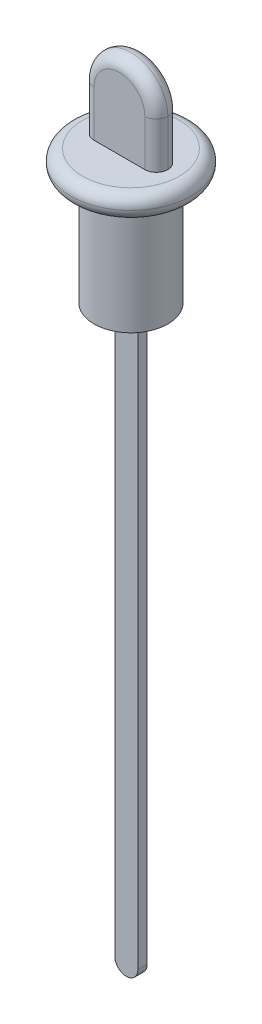
ISO-10303-21;
HEADER;
FILE_DESCRIPTION(('STEP AP214'),'2;1');
FILE_NAME('part.step','',(''),(''),'','','');
FILE_SCHEMA(('AUTOMOTIVE_DESIGN { 1 0 10303 214 1 1 1 1 }'));
ENDSEC;
DATA;
#1=APPLICATION_CONTEXT('core data for automotive mechanical design processes');
#2=APPLICATION_PROTOCOL_DEFINITION('international standard','automotive_design',2000,#1);
#3=PRODUCT_CONTEXT('',#1,'mechanical');
#4=PRODUCT('Part','Part','',(#3));
#5=PRODUCT_RELATED_PRODUCT_CATEGORY('part','',(#4));
#6=PRODUCT_DEFINITION_FORMATION('','',#4);
#7=PRODUCT_DEFINITION_CONTEXT('part definition',#1,'design');
#8=PRODUCT_DEFINITION('design','',#6,#7);
#9=PRODUCT_DEFINITION_SHAPE('','',#8);
#10=(LENGTH_UNIT() NAMED_UNIT(*) SI_UNIT(.MILLI.,.METRE.));
#11=(NAMED_UNIT(*) PLANE_ANGLE_UNIT() SI_UNIT($,.RADIAN.));
#12=(NAMED_UNIT(*) SI_UNIT($,.STERADIAN.) SOLID_ANGLE_UNIT());
#13=UNCERTAINTY_MEASURE_WITH_UNIT(LENGTH_MEASURE(1.E-05),#10,'distance_accuracy_value','');
#14=(GEOMETRIC_REPRESENTATION_CONTEXT(3) GLOBAL_UNCERTAINTY_ASSIGNED_CONTEXT((#13)) GLOBAL_UNIT_ASSIGNED_CONTEXT((#10,
#11,#12)) REPRESENTATION_CONTEXT('',''));
#15=CARTESIAN_POINT('',(0.,0.,0.));
#16=DIRECTION('',(0.,0.,1.));
#17=DIRECTION('',(1.,0.,0.));
#18=AXIS2_PLACEMENT_3D('',#15,#16,#17);
#19=CARTESIAN_POINT('',(0.,-15.24,0.));
#20=DIRECTION('',(0.,1.,0.));
#21=DIRECTION('',(0.,0.,1.));
#22=AXIS2_PLACEMENT_3D('',#19,#20,#21);
#23=PLANE('',#22);
#24=CARTESIAN_POINT('',(0.,-15.24,0.));
#25=DIRECTION('',(0.,1.,0.));
#26=DIRECTION('',(0.,0.,1.));
#27=AXIS2_PLACEMENT_3D('',#24,#25,#26);
#28=CIRCLE('',#27,5.08);
#29=CARTESIAN_POINT('',(0.,-15.24,5.08));
#30=VERTEX_POINT('',#29);
#31=EDGE_CURVE('E151',#30,#30,#28,.T.);
#32=ORIENTED_EDGE('',*,*,#31,.F.);
#33=EDGE_LOOP('',(#32));
#34=FACE_BOUND('',#33,.T.);
#35=DIRECTION('',(0.,0.,-1.));
#36=VECTOR('',#35,1.);
#37=CARTESIAN_POINT('',(-1.5875,-15.24,-0.635));
#38=LINE('',#37,#36);
#39=CARTESIAN_POINT('',(-1.5875,-15.24,0.635));
#40=VERTEX_POINT('',#39);
#41=CARTESIAN_POINT('',(-1.5875,-15.24,-0.635));
#42=VERTEX_POINT('',#41);
#43=EDGE_CURVE('E116',#40,#42,#38,.T.);
#44=ORIENTED_EDGE('',*,*,#43,.F.);
#45=DIRECTION('',(-1.,0.,0.));
#46=VECTOR('',#45,1.);
#47=CARTESIAN_POINT('',(1.5875,-15.24,0.635));
#48=LINE('',#47,#46);
#49=CARTESIAN_POINT('',(1.5875,-15.24,0.635));
#50=VERTEX_POINT('',#49);
#51=EDGE_CURVE('E121',#50,#40,#48,.T.);
#52=ORIENTED_EDGE('',*,*,#51,.F.);
#53=DIRECTION('',(0.,0.,1.));
#54=VECTOR('',#53,1.);
#55=CARTESIAN_POINT('',(1.5875,-15.24,-0.635));
#56=LINE('',#55,#54);
#57=CARTESIAN_POINT('',(1.5875,-15.24,-0.635));
#58=VERTEX_POINT('',#57);
#59=EDGE_CURVE('E132',#58,#50,#56,.T.);
#60=ORIENTED_EDGE('',*,*,#59,.F.);
#61=DIRECTION('',(1.,0.,0.));
#62=VECTOR('',#61,1.);
#63=CARTESIAN_POINT('',(1.5875,-15.24,-0.635));
#64=LINE('',#63,#62);
#65=EDGE_CURVE('E129',#42,#58,#64,.T.);
#66=ORIENTED_EDGE('',*,*,#65,.F.);
#67=EDGE_LOOP('',(#44,#52,#60,#66));
#68=FACE_BOUND('',#67,.T.);
#69=ADVANCED_FACE('F32',(#34,#68),#23,.F.);
#70=CARTESIAN_POINT('',(0.,3.175,0.));
#71=DIRECTION('',(0.,1.,0.));
#72=DIRECTION('',(0.,0.,1.));
#73=AXIS2_PLACEMENT_3D('',#70,#71,#72);
#74=PLANE('',#73);
#75=CARTESIAN_POINT('',(0.,3.175,0.));
#76=DIRECTION('',(0.,1.,0.));
#77=DIRECTION('',(0.,0.,1.));
#78=AXIS2_PLACEMENT_3D('',#75,#76,#77);
#79=CIRCLE('',#78,6.6675);
#80=CARTESIAN_POINT('',(0.,3.175,6.6675));
#81=VERTEX_POINT('',#80);
#82=EDGE_CURVE('E172',#81,#81,#79,.T.);
#83=ORIENTED_EDGE('',*,*,#82,.T.);
#84=EDGE_LOOP('',(#83));
#85=FACE_BOUND('',#84,.T.);
#86=DIRECTION('',(1.,0.,0.));
#87=VECTOR('',#86,1.);
#88=CARTESIAN_POINT('',(5.08,3.175,1.5875));
#89=LINE('',#88,#87);
#90=CARTESIAN_POINT('',(-3.4925,3.175,1.5875));
#91=VERTEX_POINT('',#90);
#92=CARTESIAN_POINT('',(3.4925,3.175,1.5875));
#93=VERTEX_POINT('',#92);
#94=EDGE_CURVE('E143',#91,#93,#89,.T.);
#95=ORIENTED_EDGE('',*,*,#94,.F.);
#96=CARTESIAN_POINT('',(-3.4925,3.175,0.));
#97=DIRECTION('',(0.,1.,0.));
#98=DIRECTION('',(0.,0.,1.));
#99=AXIS2_PLACEMENT_3D('',#96,#97,#98);
#100=CIRCLE('',#99,1.5875);
#101=CARTESIAN_POINT('',(-5.08,3.175,0.));
#102=VERTEX_POINT('',#101);
#103=EDGE_CURVE('E179',#91,#102,#100,.F.);
#104=ORIENTED_EDGE('',*,*,#103,.T.);
#105=CARTESIAN_POINT('',(-3.4925,3.175,0.));
#106=DIRECTION('',(0.,1.,0.));
#107=DIRECTION('',(0.,0.,1.));
#108=AXIS2_PLACEMENT_3D('',#105,#106,#107);
#109=CIRCLE('',#108,1.5875);
#110=CARTESIAN_POINT('',(-3.4925,3.175,-1.5875));
#111=VERTEX_POINT('',#110);
#112=EDGE_CURVE('E177',#102,#111,#109,.F.);
#113=ORIENTED_EDGE('',*,*,#112,.T.);
#114=DIRECTION('',(1.,0.,0.));
#115=VECTOR('',#114,1.);
#116=CARTESIAN_POINT('',(5.08,3.175,-1.5875));
#117=LINE('',#116,#115);
#118=CARTESIAN_POINT('',(3.4925,3.175,-1.5875));
#119=VERTEX_POINT('',#118);
#120=EDGE_CURVE('E147',#111,#119,#117,.T.);
#121=ORIENTED_EDGE('',*,*,#120,.T.);
#122=CARTESIAN_POINT('',(3.4925,3.175,0.));
#123=DIRECTION('',(0.,1.,0.));
#124=DIRECTION('',(0.,0.,1.));
#125=AXIS2_PLACEMENT_3D('',#122,#123,#124);
#126=CIRCLE('',#125,1.5875);
#127=CARTESIAN_POINT('',(5.08,3.175,0.));
#128=VERTEX_POINT('',#127);
#129=EDGE_CURVE('E175',#119,#128,#126,.F.);
#130=ORIENTED_EDGE('',*,*,#129,.T.);
#131=CARTESIAN_POINT('',(3.4925,3.175,0.));
#132=DIRECTION('',(0.,1.,0.));
#133=DIRECTION('',(0.,0.,1.));
#134=AXIS2_PLACEMENT_3D('',#131,#132,#133);
#135=CIRCLE('',#134,1.5875);
#136=EDGE_CURVE('E181',#128,#93,#135,.F.);
#137=ORIENTED_EDGE('',*,*,#136,.T.);
#138=EDGE_LOOP('',(#95,#104,#113,#121,#130,#137));
#139=FACE_BOUND('',#138,.T.);
#140=ADVANCED_FACE('F233',(#85,#139),#74,.T.);
#141=CARTESIAN_POINT('',(0.,-15.24,0.));
#142=DIRECTION('',(0.,1.,0.));
#143=DIRECTION('',(0.,0.,1.));
#144=AXIS2_PLACEMENT_3D('',#141,#142,#143);
#145=CYLINDRICAL_SURFACE('',#144,5.08);
#146=CARTESIAN_POINT('',(0.,0.,0.));
#147=DIRECTION('',(0.,1.,0.));
#148=DIRECTION('',(0.,0.,1.));
#149=AXIS2_PLACEMENT_3D('',#146,#147,#148);
#150=CIRCLE('',#149,5.08);
#151=CARTESIAN_POINT('',(0.,0.,5.08));
#152=VERTEX_POINT('',#151);
#153=EDGE_CURVE('E146',#152,#152,#150,.T.);
#154=CARTESIAN_POINT('',(0.,-15.24,5.08));
#155=CARTESIAN_POINT('',(0.,-15.08125,5.08));
#156=CARTESIAN_POINT('',(0.,-14.9225,5.08));
#157=CARTESIAN_POINT('',(0.,-14.605,5.08));
#158=CARTESIAN_POINT('',(0.,-14.44625,5.08));
#159=CARTESIAN_POINT('',(0.,-14.12875,5.08));
#160=CARTESIAN_POINT('',(0.,-13.97,5.08));
#161=CARTESIAN_POINT('',(0.,-13.6525,5.08));
#162=CARTESIAN_POINT('',(0.,-13.49375,5.08));
#163=CARTESIAN_POINT('',(0.,-13.17625,5.08));
#164=CARTESIAN_POINT('',(0.,-13.0175,5.08));
#165=CARTESIAN_POINT('',(0.,-12.7,5.08));
#166=CARTESIAN_POINT('',(0.,-12.54125,5.08));
#167=CARTESIAN_POINT('',(0.,-12.22375,5.08));
#168=CARTESIAN_POINT('',(0.,-12.065,5.08));
#169=CARTESIAN_POINT('',(0.,-11.7475,5.08));
#170=CARTESIAN_POINT('',(0.,-11.58875,5.08));
#171=CARTESIAN_POINT('',(0.,-11.27125,5.08));
#172=CARTESIAN_POINT('',(0.,-11.1125,5.08));
#173=CARTESIAN_POINT('',(0.,-10.795,5.08));
#174=CARTESIAN_POINT('',(0.,-10.63625,5.08));
#175=CARTESIAN_POINT('',(0.,-10.31875,5.08));
#176=CARTESIAN_POINT('',(0.,-10.16,5.08));
#177=CARTESIAN_POINT('',(0.,-9.8425,5.08));
#178=CARTESIAN_POINT('',(0.,-9.68375,5.08));
#179=CARTESIAN_POINT('',(0.,-9.36625,5.08));
#180=CARTESIAN_POINT('',(0.,-9.2075,5.08));
#181=CARTESIAN_POINT('',(0.,-8.89,5.08));
#182=CARTESIAN_POINT('',(0.,-8.73125,5.08));
#183=CARTESIAN_POINT('',(0.,-8.41375,5.08));
#184=CARTESIAN_POINT('',(0.,-8.255,5.08));
#185=CARTESIAN_POINT('',(0.,-7.9375,5.08));
#186=CARTESIAN_POINT('',(0.,-7.77875,5.08));
#187=CARTESIAN_POINT('',(0.,-7.46125,5.08));
#188=CARTESIAN_POINT('',(0.,-7.3025,5.08));
#189=CARTESIAN_POINT('',(0.,-6.985,5.08));
#190=CARTESIAN_POINT('',(0.,-6.82625,5.08));
#191=CARTESIAN_POINT('',(0.,-6.50875,5.08));
#192=CARTESIAN_POINT('',(0.,-6.35,5.08));
#193=CARTESIAN_POINT('',(0.,-6.0325,5.08));
#194=CARTESIAN_POINT('',(0.,-5.87375,5.08));
#195=CARTESIAN_POINT('',(0.,-5.55625,5.08));
#196=CARTESIAN_POINT('',(0.,-5.3975,5.08));
#197=CARTESIAN_POINT('',(0.,-5.08,5.08));
#198=CARTESIAN_POINT('',(0.,-4.92125,5.08));
#199=CARTESIAN_POINT('',(0.,-4.60375,5.08));
#200=CARTESIAN_POINT('',(0.,-4.445,5.08));
#201=CARTESIAN_POINT('',(0.,-4.1275,5.08));
#202=CARTESIAN_POINT('',(0.,-3.96875,5.08));
#203=CARTESIAN_POINT('',(0.,-3.65125,5.08));
#204=CARTESIAN_POINT('',(0.,-3.4925,5.08));
#205=CARTESIAN_POINT('',(0.,-3.175,5.08));
#206=CARTESIAN_POINT('',(0.,-3.01625,5.08));
#207=CARTESIAN_POINT('',(0.,-2.69875,5.08));
#208=CARTESIAN_POINT('',(0.,-2.54,5.08));
#209=CARTESIAN_POINT('',(0.,-2.2225,5.08));
#210=CARTESIAN_POINT('',(0.,-2.06375,5.08));
#211=CARTESIAN_POINT('',(0.,-1.74625,5.08));
#212=CARTESIAN_POINT('',(0.,-1.5875,5.08));
#213=CARTESIAN_POINT('',(0.,-1.27,5.08));
#214=CARTESIAN_POINT('',(0.,-1.11125,5.08));
#215=CARTESIAN_POINT('',(0.,-0.79375,5.08));
#216=CARTESIAN_POINT('',(0.,-0.634999999999999,5.08));
#217=CARTESIAN_POINT('',(0.,-0.3175,5.08));
#218=CARTESIAN_POINT('',(0.,-0.15875,5.08));
#219=CARTESIAN_POINT('',(0.,0.,5.08));
#220=B_SPLINE_CURVE_WITH_KNOTS('',3,(#154,#155,#156,#157,#158,#159,#160,#161,#162,#163,#164,
#165,#166,#167,#168,#169,#170,#171,#172,#173,#174,#175,#176,#177,#178,#179,#180,#181,#182,#183,
#184,#185,#186,#187,#188,#189,#190,#191,#192,#193,#194,#195,#196,#197,#198,#199,#200,#201,#202,
#203,#204,#205,#206,#207,#208,#209,#210,#211,#212,#213,#214,#215,#216,#217,#218,#219),
.UNSPECIFIED.,.F.,.F.,(4,2,2,2,2,2,2,2,2,2,2,2,2,2,2,2,2,2,2,2,2,2,2,2,2,2,2,2,2,2,2,2,4),(0.,
0.476250000000001,0.9525,1.42875,1.905,2.38125,2.8575,3.33375,3.81,4.28625,4.7625,5.23875,5.715,
6.19125,6.6675,7.14375,7.62,8.09625,8.5725,9.04875,9.525,10.00125,10.4775,10.95375,11.43,
11.90625,12.3825,12.85875,13.335,13.81125,14.2875,14.76375,15.24),.UNSPECIFIED.);
#221=EDGE_CURVE('BSEAM239',#30,#152,#220,.T.);
#222=ORIENTED_EDGE('',*,*,#31,.T.);
#223=ORIENTED_EDGE('',*,*,#153,.F.);
#224=ORIENTED_EDGE('',*,*,#221,.T.);
#225=ORIENTED_EDGE('',*,*,#221,.F.);
#226=EDGE_LOOP('',(#222,#224,#223,#225));
#227=FACE_BOUND('',#226,.T.);
#228=ADVANCED_FACE('F239',(#227),#145,.T.);
#229=CARTESIAN_POINT('',(0.,0.,0.));
#230=DIRECTION('',(0.,1.,0.));
#231=DIRECTION('',(0.,0.,1.));
#232=AXIS2_PLACEMENT_3D('',#229,#230,#231);
#233=PLANE('',#232);
#234=CARTESIAN_POINT('',(0.,0.,0.));
#235=DIRECTION('',(0.,1.,0.));
#236=DIRECTION('',(0.,0.,1.));
#237=AXIS2_PLACEMENT_3D('',#234,#235,#236);
#238=CIRCLE('',#237,6.6675);
#239=CARTESIAN_POINT('',(0.,0.,6.6675));
#240=VERTEX_POINT('',#239);
#241=EDGE_CURVE('E169',#240,#240,#238,.F.);
#242=ORIENTED_EDGE('',*,*,#241,.T.);
#243=EDGE_LOOP('',(#242));
#244=FACE_BOUND('',#243,.T.);
#245=ORIENTED_EDGE('',*,*,#153,.T.);
#246=EDGE_LOOP('',(#245));
#247=FACE_BOUND('',#246,.T.);
#248=ADVANCED_FACE('F245',(#244,#247),#233,.F.);
#249=CARTESIAN_POINT('',(0.,9.525,1.5875));
#250=DIRECTION('',(0.,0.,-1.));
#251=DIRECTION('',(-1.,0.,0.));
#252=AXIS2_PLACEMENT_3D('',#249,#250,#251);
#253=PLANE('',#252);
#254=CARTESIAN_POINT('',(0.,9.525,1.5875));
#255=DIRECTION('',(0.,0.,-1.));
#256=DIRECTION('',(-1.,0.,0.));
#257=AXIS2_PLACEMENT_3D('',#254,#255,#256);
#258=CIRCLE('',#257,3.4925);
#259=CARTESIAN_POINT('',(3.4925,9.525,1.5875));
#260=VERTEX_POINT('',#259);
#261=CARTESIAN_POINT('',(-3.4925,9.525,1.5875));
#262=VERTEX_POINT('',#261);
#263=EDGE_CURVE('E165',#260,#262,#258,.F.);
#264=ORIENTED_EDGE('',*,*,#263,.T.);
#265=DIRECTION('',(0.,-1.,0.));
#266=VECTOR('',#265,1.);
#267=CARTESIAN_POINT('',(-3.4925,9.525,1.5875));
#268=LINE('',#267,#266);
#269=EDGE_CURVE('E167',#262,#91,#268,.T.);
#270=ORIENTED_EDGE('',*,*,#269,.T.);
#271=ORIENTED_EDGE('',*,*,#94,.T.);
#272=DIRECTION('',(0.,1.,0.));
#273=VECTOR('',#272,1.);
#274=CARTESIAN_POINT('',(3.4925,9.525,1.5875));
#275=LINE('',#274,#273);
#276=EDGE_CURVE('E163',#93,#260,#275,.T.);
#277=ORIENTED_EDGE('',*,*,#276,.T.);
#278=EDGE_LOOP('',(#264,#270,#271,#277));
#279=FACE_BOUND('',#278,.T.);
#280=ADVANCED_FACE('F370',(#279),#253,.F.);
#281=CARTESIAN_POINT('',(0.,9.525,-1.5875));
#282=DIRECTION('',(0.,0.,-1.));
#283=DIRECTION('',(-1.,0.,0.));
#284=AXIS2_PLACEMENT_3D('',#281,#282,#283);
#285=PLANE('',#284);
#286=CARTESIAN_POINT('',(0.,9.525,-1.5875));
#287=DIRECTION('',(0.,0.,-1.));
#288=DIRECTION('',(-1.,0.,0.));
#289=AXIS2_PLACEMENT_3D('',#286,#287,#288);
#290=CIRCLE('',#289,3.4925);
#291=CARTESIAN_POINT('',(-3.4925,9.525,-1.5875));
#292=VERTEX_POINT('',#291);
#293=CARTESIAN_POINT('',(3.4925,9.525,-1.5875));
#294=VERTEX_POINT('',#293);
#295=EDGE_CURVE('E154',#292,#294,#290,.T.);
#296=ORIENTED_EDGE('',*,*,#295,.T.);
#297=DIRECTION('',(0.,1.,0.));
#298=VECTOR('',#297,1.);
#299=CARTESIAN_POINT('',(3.4925,3.175,-1.5875));
#300=LINE('',#299,#298);
#301=EDGE_CURVE('E160',#294,#119,#300,.F.);
#302=ORIENTED_EDGE('',*,*,#301,.T.);
#303=ORIENTED_EDGE('',*,*,#120,.F.);
#304=DIRECTION('',(0.,-1.,0.));
#305=VECTOR('',#304,1.);
#306=CARTESIAN_POINT('',(-3.4925,9.525,-1.5875));
#307=LINE('',#306,#305);
#308=EDGE_CURVE('E158',#111,#292,#307,.F.);
#309=ORIENTED_EDGE('',*,*,#308,.T.);
#310=EDGE_LOOP('',(#296,#302,#303,#309));
#311=FACE_BOUND('',#310,.T.);
#312=ADVANCED_FACE('F273',(#311),#285,.T.);
#313=CARTESIAN_POINT('',(-3.4925,9.525,0.));
#314=DIRECTION('',(0.,-1.,0.));
#315=DIRECTION('',(1.,0.,0.));
#316=AXIS2_PLACEMENT_3D('',#313,#314,#315);
#317=CYLINDRICAL_SURFACE('',#316,1.5875);
#318=ORIENTED_EDGE('',*,*,#103,.F.);
#319=ORIENTED_EDGE('',*,*,#269,.F.);
#320=CARTESIAN_POINT('',(-3.4925,9.525,0.));
#321=DIRECTION('',(0.,1.,0.));
#322=DIRECTION('',(0.,0.,1.));
#323=AXIS2_PLACEMENT_3D('',#320,#321,#322);
#324=CIRCLE('',#323,1.5875);
#325=CARTESIAN_POINT('',(-5.08,9.525,0.));
#326=VERTEX_POINT('',#325);
#327=EDGE_CURVE('E150',#326,#262,#324,.T.);
#328=ORIENTED_EDGE('',*,*,#327,.F.);
#329=DIRECTION('',(0.,-1.,0.));
#330=VECTOR('',#329,1.);
#331=CARTESIAN_POINT('',(-5.08,3.175,0.));
#332=LINE('',#331,#330);
#333=EDGE_CURVE('E199',#102,#326,#332,.F.);
#334=ORIENTED_EDGE('',*,*,#333,.F.);
#335=EDGE_LOOP('',(#318,#319,#328,#334));
#336=FACE_BOUND('',#335,.T.);
#337=ADVANCED_FACE('F269',(#336),#317,.T.);
#338=CARTESIAN_POINT('',(0.,9.525,0.));
#339=DIRECTION('',(0.,0.,-1.));
#340=DIRECTION('',(-1.,0.,0.));
#341=AXIS2_PLACEMENT_3D('',#338,#339,#340);
#342=TOROIDAL_SURFACE('',#341,3.4925,1.5875);
#343=ORIENTED_EDGE('',*,*,#327,.T.);
#344=ORIENTED_EDGE('',*,*,#263,.F.);
#345=CARTESIAN_POINT('',(3.4925,9.525,0.));
#346=DIRECTION('',(0.,-1.,0.));
#347=DIRECTION('',(0.,0.,-1.));
#348=AXIS2_PLACEMENT_3D('',#345,#346,#347);
#349=CIRCLE('',#348,1.5875);
#350=CARTESIAN_POINT('',(5.08,9.525,0.));
#351=VERTEX_POINT('',#350);
#352=EDGE_CURVE('E196',#351,#260,#349,.T.);
#353=ORIENTED_EDGE('',*,*,#352,.F.);
#354=CARTESIAN_POINT('',(0.,9.525,0.));
#355=DIRECTION('',(0.,0.,-1.));
#356=DIRECTION('',(-1.,0.,0.));
#357=AXIS2_PLACEMENT_3D('',#354,#355,#356);
#358=CIRCLE('',#357,5.08);
#359=EDGE_CURVE('E193',#326,#351,#358,.T.);
#360=ORIENTED_EDGE('',*,*,#359,.F.);
#361=EDGE_LOOP('',(#343,#344,#353,#360));
#362=FACE_BOUND('',#361,.T.);
#363=ADVANCED_FACE('F265',(#362),#342,.T.);
#364=CARTESIAN_POINT('',(-3.4925,3.175,0.));
#365=DIRECTION('',(0.,1.,0.));
#366=DIRECTION('',(-1.,0.,0.));
#367=AXIS2_PLACEMENT_3D('',#364,#365,#366);
#368=CYLINDRICAL_SURFACE('',#367,1.5875);
#369=ORIENTED_EDGE('',*,*,#112,.F.);
#370=ORIENTED_EDGE('',*,*,#333,.T.);
#371=CARTESIAN_POINT('',(-3.4925,9.525,0.));
#372=DIRECTION('',(0.,1.,0.));
#373=DIRECTION('',(0.,0.,1.));
#374=AXIS2_PLACEMENT_3D('',#371,#372,#373);
#375=CIRCLE('',#374,1.5875);
#376=EDGE_CURVE('E190',#292,#326,#375,.T.);
#377=ORIENTED_EDGE('',*,*,#376,.F.);
#378=ORIENTED_EDGE('',*,*,#308,.F.);
#379=EDGE_LOOP('',(#369,#370,#377,#378));
#380=FACE_BOUND('',#379,.T.);
#381=ADVANCED_FACE('F261',(#380),#368,.T.);
#382=CARTESIAN_POINT('',(3.4925,9.525,0.));
#383=DIRECTION('',(0.,1.,0.));
#384=DIRECTION('',(0.,0.,1.));
#385=AXIS2_PLACEMENT_3D('',#382,#383,#384);
#386=CYLINDRICAL_SURFACE('',#385,1.5875);
#387=ORIENTED_EDGE('',*,*,#276,.F.);
#388=ORIENTED_EDGE('',*,*,#136,.F.);
#389=DIRECTION('',(0.,1.,0.));
#390=VECTOR('',#389,1.);
#391=CARTESIAN_POINT('',(5.08,3.175,0.));
#392=LINE('',#391,#390);
#393=EDGE_CURVE('E187',#351,#128,#392,.F.);
#394=ORIENTED_EDGE('',*,*,#393,.F.);
#395=ORIENTED_EDGE('',*,*,#352,.T.);
#396=EDGE_LOOP('',(#387,#388,#394,#395));
#397=FACE_BOUND('',#396,.T.);
#398=ADVANCED_FACE('F257',(#397),#386,.T.);
#399=CARTESIAN_POINT('',(0.,9.525,0.));
#400=DIRECTION('',(0.,0.,-1.));
#401=DIRECTION('',(-1.,0.,0.));
#402=AXIS2_PLACEMENT_3D('',#399,#400,#401);
#403=TOROIDAL_SURFACE('',#402,3.4925,1.5875);
#404=ORIENTED_EDGE('',*,*,#376,.T.);
#405=ORIENTED_EDGE('',*,*,#359,.T.);
#406=CARTESIAN_POINT('',(3.4925,9.525,0.));
#407=DIRECTION('',(0.,-1.,0.));
#408=DIRECTION('',(0.,0.,-1.));
#409=AXIS2_PLACEMENT_3D('',#406,#407,#408);
#410=CIRCLE('',#409,1.5875);
#411=EDGE_CURVE('E184',#294,#351,#410,.T.);
#412=ORIENTED_EDGE('',*,*,#411,.F.);
#413=ORIENTED_EDGE('',*,*,#295,.F.);
#414=EDGE_LOOP('',(#404,#405,#412,#413));
#415=FACE_BOUND('',#414,.T.);
#416=ADVANCED_FACE('F253',(#415),#403,.T.);
#417=CARTESIAN_POINT('',(3.4925,3.175,0.));
#418=DIRECTION('',(0.,-1.,0.));
#419=DIRECTION('',(0.,0.,-1.));
#420=AXIS2_PLACEMENT_3D('',#417,#418,#419);
#421=CYLINDRICAL_SURFACE('',#420,1.5875);
#422=ORIENTED_EDGE('',*,*,#129,.F.);
#423=ORIENTED_EDGE('',*,*,#301,.F.);
#424=ORIENTED_EDGE('',*,*,#411,.T.);
#425=ORIENTED_EDGE('',*,*,#393,.T.);
#426=EDGE_LOOP('',(#422,#423,#424,#425));
#427=FACE_BOUND('',#426,.T.);
#428=ADVANCED_FACE('F249',(#427),#421,.T.);
#429=CARTESIAN_POINT('',(0.,1.5875,0.));
#430=DIRECTION('',(0.,1.,0.));
#431=DIRECTION('',(0.,0.,1.));
#432=AXIS2_PLACEMENT_3D('',#429,#430,#431);
#433=TOROIDAL_SURFACE('',#432,6.6675,1.5875);
#434=ORIENTED_EDGE('',*,*,#82,.F.);
#435=EDGE_LOOP('',(#434));
#436=FACE_BOUND('',#435,.T.);
#437=CARTESIAN_POINT('',(0.,1.5875,0.));
#438=DIRECTION('',(0.,1.,0.));
#439=DIRECTION('',(0.,0.,1.));
#440=AXIS2_PLACEMENT_3D('',#437,#438,#439);
#441=CIRCLE('',#440,8.255);
#442=CARTESIAN_POINT('',(0.,1.5875,8.255));
#443=VERTEX_POINT('',#442);
#444=EDGE_CURVE('E142',#443,#443,#441,.F.);
#445=ORIENTED_EDGE('',*,*,#444,.F.);
#446=EDGE_LOOP('',(#445));
#447=FACE_BOUND('',#446,.T.);
#448=ADVANCED_FACE('F252',(#436,#447),#433,.T.);
#449=CARTESIAN_POINT('',(0.,1.5875,0.));
#450=DIRECTION('',(0.,1.,0.));
#451=DIRECTION('',(0.,0.,1.));
#452=AXIS2_PLACEMENT_3D('',#449,#450,#451);
#453=TOROIDAL_SURFACE('',#452,6.6675,1.5875);
#454=ORIENTED_EDGE('',*,*,#241,.F.);
#455=EDGE_LOOP('',(#454));
#456=FACE_BOUND('',#455,.T.);
#457=ORIENTED_EDGE('',*,*,#444,.T.);
#458=EDGE_LOOP('',(#457));
#459=FACE_BOUND('',#458,.T.);
#460=ADVANCED_FACE('F275',(#456,#459),#453,.T.);
#461=CARTESIAN_POINT('',(-1.5875,-95.25,-0.635));
#462=DIRECTION('',(1.,0.,0.));
#463=DIRECTION('',(0.,0.,-1.));
#464=AXIS2_PLACEMENT_3D('',#461,#462,#463);
#465=PLANE('',#464);
#466=DIRECTION('',(0.,1.,0.));
#467=VECTOR('',#466,1.);
#468=CARTESIAN_POINT('',(-1.5875,-95.25,-0.635));
#469=LINE('',#468,#467);
#470=CARTESIAN_POINT('',(-1.5875,-93.6625,-0.635));
#471=VERTEX_POINT('',#470);
#472=EDGE_CURVE('E140',#471,#42,#469,.T.);
#473=ORIENTED_EDGE('',*,*,#472,.F.);
#474=DIRECTION('',(0.,0.,-1.));
#475=VECTOR('',#474,1.);
#476=CARTESIAN_POINT('',(-1.5875,-93.6625,0.635));
#477=LINE('',#476,#475);
#478=CARTESIAN_POINT('',(-1.5875,-93.6625,0.635));
#479=VERTEX_POINT('',#478);
#480=EDGE_CURVE('E118',#471,#479,#477,.F.);
#481=ORIENTED_EDGE('',*,*,#480,.T.);
#482=DIRECTION('',(0.,1.,0.));
#483=VECTOR('',#482,1.);
#484=CARTESIAN_POINT('',(-1.5875,-95.25,0.635));
#485=LINE('',#484,#483);
#486=EDGE_CURVE('E112',#479,#40,#485,.T.);
#487=ORIENTED_EDGE('',*,*,#486,.T.);
#488=ORIENTED_EDGE('',*,*,#43,.T.);
#489=EDGE_LOOP('',(#473,#481,#487,#488));
#490=FACE_BOUND('',#489,.T.);
#491=ADVANCED_FACE('F115',(#490),#465,.F.);
#492=CARTESIAN_POINT('',(1.5875,-95.25,-0.635));
#493=DIRECTION('',(0.,0.,1.));
#494=DIRECTION('',(1.,0.,0.));
#495=AXIS2_PLACEMENT_3D('',#492,#493,#494);
#496=PLANE('',#495);
#497=CARTESIAN_POINT('',(0.,-93.6625,-0.635));
#498=DIRECTION('',(0.,0.,1.));
#499=DIRECTION('',(1.,0.,0.));
#500=AXIS2_PLACEMENT_3D('',#497,#498,#499);
#501=CIRCLE('',#500,1.5875);
#502=CARTESIAN_POINT('',(1.5875,-93.6625,-0.635));
#503=VERTEX_POINT('',#502);
#504=CARTESIAN_POINT('',(0.,-95.25,-0.635));
#505=VERTEX_POINT('',#504);
#506=EDGE_CURVE('E183',#503,#505,#501,.F.);
#507=ORIENTED_EDGE('',*,*,#506,.T.);
#508=CARTESIAN_POINT('',(0.,-93.6625,-0.635));
#509=DIRECTION('',(0.,0.,1.));
#510=DIRECTION('',(1.,0.,0.));
#511=AXIS2_PLACEMENT_3D('',#508,#509,#510);
#512=CIRCLE('',#511,1.5875);
#513=EDGE_CURVE('E207',#505,#471,#512,.F.);
#514=ORIENTED_EDGE('',*,*,#513,.T.);
#515=ORIENTED_EDGE('',*,*,#472,.T.);
#516=ORIENTED_EDGE('',*,*,#65,.T.);
#517=DIRECTION('',(0.,1.,0.));
#518=VECTOR('',#517,1.);
#519=CARTESIAN_POINT('',(1.5875,-95.25,-0.635));
#520=LINE('',#519,#518);
#521=EDGE_CURVE('E138',#503,#58,#520,.T.);
#522=ORIENTED_EDGE('',*,*,#521,.F.);
#523=EDGE_LOOP('',(#507,#514,#515,#516,#522));
#524=FACE_BOUND('',#523,.T.);
#525=ADVANCED_FACE('F213',(#524),#496,.F.);
#526=CARTESIAN_POINT('',(1.5875,-95.25,-0.635));
#527=DIRECTION('',(-1.,0.,0.));
#528=DIRECTION('',(0.,0.,1.));
#529=AXIS2_PLACEMENT_3D('',#526,#527,#528);
#530=PLANE('',#529);
#531=DIRECTION('',(0.,1.,0.));
#532=VECTOR('',#531,1.);
#533=CARTESIAN_POINT('',(1.5875,-95.25,0.635));
#534=LINE('',#533,#532);
#535=CARTESIAN_POINT('',(1.5875,-93.6625,0.635));
#536=VERTEX_POINT('',#535);
#537=EDGE_CURVE('E120',#536,#50,#534,.T.);
#538=ORIENTED_EDGE('',*,*,#537,.F.);
#539=DIRECTION('',(0.,0.,1.));
#540=VECTOR('',#539,1.);
#541=CARTESIAN_POINT('',(1.5875,-93.6625,-0.635));
#542=LINE('',#541,#540);
#543=EDGE_CURVE('E11',#536,#503,#542,.F.);
#544=ORIENTED_EDGE('',*,*,#543,.T.);
#545=ORIENTED_EDGE('',*,*,#521,.T.);
#546=ORIENTED_EDGE('',*,*,#59,.T.);
#547=EDGE_LOOP('',(#538,#544,#545,#546));
#548=FACE_BOUND('',#547,.T.);
#549=ADVANCED_FACE('F223',(#548),#530,.F.);
#550=CARTESIAN_POINT('',(1.5875,-95.25,0.635));
#551=DIRECTION('',(0.,0.,-1.));
#552=DIRECTION('',(-1.,0.,0.));
#553=AXIS2_PLACEMENT_3D('',#550,#551,#552);
#554=PLANE('',#553);
#555=ORIENTED_EDGE('',*,*,#486,.F.);
#556=CARTESIAN_POINT('',(0.,-93.6625,0.635));
#557=DIRECTION('',(0.,0.,-1.));
#558=DIRECTION('',(-1.,0.,0.));
#559=AXIS2_PLACEMENT_3D('',#556,#557,#558);
#560=CIRCLE('',#559,1.5875);
#561=CARTESIAN_POINT('',(0.,-95.25,0.635));
#562=VERTEX_POINT('',#561);
#563=EDGE_CURVE('E41',#479,#562,#560,.F.);
#564=ORIENTED_EDGE('',*,*,#563,.T.);
#565=CARTESIAN_POINT('',(0.,-93.6625,0.635));
#566=DIRECTION('',(0.,0.,-1.));
#567=DIRECTION('',(-1.,0.,0.));
#568=AXIS2_PLACEMENT_3D('',#565,#566,#567);
#569=CIRCLE('',#568,1.5875);
#570=EDGE_CURVE('E48',#562,#536,#569,.F.);
#571=ORIENTED_EDGE('',*,*,#570,.T.);
#572=ORIENTED_EDGE('',*,*,#537,.T.);
#573=ORIENTED_EDGE('',*,*,#51,.T.);
#574=EDGE_LOOP('',(#555,#564,#571,#572,#573));
#575=FACE_BOUND('',#574,.T.);
#576=ADVANCED_FACE('F131',(#575),#554,.F.);
#577=CARTESIAN_POINT('',(0.,-93.6625,0.));
#578=DIRECTION('',(0.,0.,-1.));
#579=DIRECTION('',(-1.,0.,0.));
#580=AXIS2_PLACEMENT_3D('',#577,#578,#579);
#581=CYLINDRICAL_SURFACE('',#580,1.5875);
#582=ORIENTED_EDGE('',*,*,#543,.F.);
#583=ORIENTED_EDGE('',*,*,#570,.F.);
#584=DIRECTION('',(0.,0.,1.));
#585=VECTOR('',#584,1.);
#586=CARTESIAN_POINT('',(0.,-95.25,0.635));
#587=LINE('',#586,#585);
#588=EDGE_CURVE('E36',#505,#562,#587,.T.);
#589=ORIENTED_EDGE('',*,*,#588,.F.);
#590=ORIENTED_EDGE('',*,*,#506,.F.);
#591=EDGE_LOOP('',(#582,#583,#589,#590));
#592=FACE_BOUND('',#591,.T.);
#593=ADVANCED_FACE('F34',(#592),#581,.T.);
#594=CARTESIAN_POINT('',(0.,-93.6625,0.));
#595=DIRECTION('',(0.,0.,1.));
#596=DIRECTION('',(1.,0.,0.));
#597=AXIS2_PLACEMENT_3D('',#594,#595,#596);
#598=CYLINDRICAL_SURFACE('',#597,1.5875);
#599=ORIENTED_EDGE('',*,*,#563,.F.);
#600=ORIENTED_EDGE('',*,*,#480,.F.);
#601=ORIENTED_EDGE('',*,*,#513,.F.);
#602=ORIENTED_EDGE('',*,*,#588,.T.);
#603=EDGE_LOOP('',(#599,#600,#601,#602));
#604=FACE_BOUND('',#603,.T.);
#605=ADVANCED_FACE('F219',(#604),#598,.T.);
#606=CLOSED_SHELL('',(#69,#140,#228,#248,#280,#312,#337,#363,#381,#398,#416,#428,#448,#460,#491,
#525,#549,#576,#593,#605));
#607=MANIFOLD_SOLID_BREP('B2',#606);
#608=ADVANCED_BREP_SHAPE_REPRESENTATION('',(#18,#607),#14);
#609=SHAPE_DEFINITION_REPRESENTATION(#9,#608);
ENDSEC;
END-ISO-10303-21;
